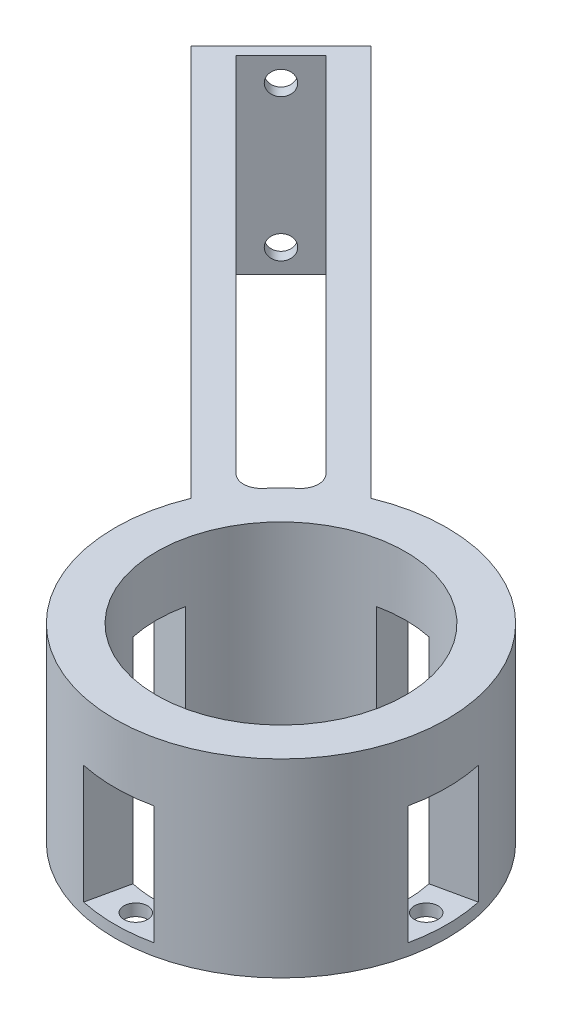
ISO-10303-21;
HEADER;
FILE_DESCRIPTION(('STEP AP214'),'2;1');
FILE_NAME('part.step','',(''),(''),'','','');
FILE_SCHEMA(('AUTOMOTIVE_DESIGN { 1 0 10303 214 1 1 1 1 }'));
ENDSEC;
DATA;
#1=APPLICATION_CONTEXT('core data for automotive mechanical design processes');
#2=APPLICATION_PROTOCOL_DEFINITION('international standard','automotive_design',2000,#1);
#3=PRODUCT_CONTEXT('',#1,'mechanical');
#4=PRODUCT('Part','Part','',(#3));
#5=PRODUCT_RELATED_PRODUCT_CATEGORY('part','',(#4));
#6=PRODUCT_DEFINITION_FORMATION('','',#4);
#7=PRODUCT_DEFINITION_CONTEXT('part definition',#1,'design');
#8=PRODUCT_DEFINITION('design','',#6,#7);
#9=PRODUCT_DEFINITION_SHAPE('','',#8);
#10=(LENGTH_UNIT() NAMED_UNIT(*) SI_UNIT(.MILLI.,.METRE.));
#11=(NAMED_UNIT(*) PLANE_ANGLE_UNIT() SI_UNIT($,.RADIAN.));
#12=(NAMED_UNIT(*) SI_UNIT($,.STERADIAN.) SOLID_ANGLE_UNIT());
#13=UNCERTAINTY_MEASURE_WITH_UNIT(LENGTH_MEASURE(1.E-05),#10,'distance_accuracy_value','');
#14=(GEOMETRIC_REPRESENTATION_CONTEXT(3) GLOBAL_UNCERTAINTY_ASSIGNED_CONTEXT((#13)) GLOBAL_UNIT_ASSIGNED_CONTEXT((#10,
#11,#12)) REPRESENTATION_CONTEXT('',''));
#15=CARTESIAN_POINT('',(0.,0.,0.));
#16=DIRECTION('',(0.,0.,1.));
#17=DIRECTION('',(1.,0.,0.));
#18=AXIS2_PLACEMENT_3D('',#15,#16,#17);
#19=CARTESIAN_POINT('',(0.,2.,0.));
#20=DIRECTION('',(0.,-1.,0.));
#21=DIRECTION('',(0.,0.,-1.));
#22=AXIS2_PLACEMENT_3D('',#19,#20,#21);
#23=CYLINDRICAL_SURFACE('',#22,28.);
#24=CARTESIAN_POINT('',(0.,22.,0.));
#25=DIRECTION('',(0.,1.,0.));
#26=DIRECTION('',(0.,0.,1.));
#27=AXIS2_PLACEMENT_3D('',#24,#25,#26);
#28=CIRCLE('',#27,28.);
#29=CARTESIAN_POINT('',(-5.93539309209322,22.,27.3636822968389));
#30=VERTEX_POINT('',#29);
#31=CARTESIAN_POINT('',(5.93539309209294,22.,27.3636822968389));
#32=VERTEX_POINT('',#31);
#33=EDGE_CURVE('E288',#30,#32,#28,.T.);
#34=ORIENTED_EDGE('',*,*,#33,.T.);
#35=DIRECTION('',(0.,-1.,0.));
#36=VECTOR('',#35,1.);
#37=CARTESIAN_POINT('',(5.93539309209294,32.,27.3636822968389));
#38=LINE('',#37,#36);
#39=CARTESIAN_POINT('',(5.93539309209294,2.,27.3636822968389));
#40=VERTEX_POINT('',#39);
#41=EDGE_CURVE('E344',#32,#40,#38,.T.);
#42=ORIENTED_EDGE('',*,*,#41,.T.);
#43=CARTESIAN_POINT('',(0.,2.,0.));
#44=DIRECTION('',(0.,1.,0.));
#45=DIRECTION('',(0.,0.,1.));
#46=AXIS2_PLACEMENT_3D('',#43,#44,#45);
#47=CIRCLE('',#46,28.);
#48=CARTESIAN_POINT('',(-5.93539309209322,2.,27.3636822968389));
#49=VERTEX_POINT('',#48);
#50=EDGE_CURVE('E413',#49,#40,#47,.T.);
#51=ORIENTED_EDGE('',*,*,#50,.F.);
#52=DIRECTION('',(0.,-1.,0.));
#53=VECTOR('',#52,1.);
#54=CARTESIAN_POINT('',(-5.93539309209322,32.,27.3636822968389));
#55=LINE('',#54,#53);
#56=EDGE_CURVE('E332',#30,#49,#55,.T.);
#57=ORIENTED_EDGE('',*,*,#56,.F.);
#58=EDGE_LOOP('',(#34,#42,#51,#57));
#59=FACE_BOUND('',#58,.T.);
#60=DIRECTION('',(0.,-1.,0.));
#61=VECTOR('',#60,1.);
#62=CARTESIAN_POINT('',(-27.3636822968388,32.,-5.93539309209327));
#63=LINE('',#62,#61);
#64=CARTESIAN_POINT('',(-27.3636822968388,22.,-5.93539309209327));
#65=VERTEX_POINT('',#64);
#66=CARTESIAN_POINT('',(-27.3636822968388,2.,-5.93539309209327));
#67=VERTEX_POINT('',#66);
#68=EDGE_CURVE('E370',#65,#67,#63,.T.);
#69=ORIENTED_EDGE('',*,*,#68,.F.);
#70=CARTESIAN_POINT('',(-27.3636822968389,22.,5.93539309209284));
#71=VERTEX_POINT('',#70);
#72=EDGE_CURVE('E291',#65,#71,#28,.T.);
#73=ORIENTED_EDGE('',*,*,#72,.T.);
#74=DIRECTION('',(0.,-1.,0.));
#75=VECTOR('',#74,1.);
#76=CARTESIAN_POINT('',(-27.3636822968389,32.,5.93539309209284));
#77=LINE('',#76,#75);
#78=CARTESIAN_POINT('',(-27.3636822968389,2.,5.93539309209284));
#79=VERTEX_POINT('',#78);
#80=EDGE_CURVE('E330',#71,#79,#77,.T.);
#81=ORIENTED_EDGE('',*,*,#80,.T.);
#82=EDGE_CURVE('E409',#67,#79,#47,.T.);
#83=ORIENTED_EDGE('',*,*,#82,.F.);
#84=EDGE_LOOP('',(#69,#73,#81,#83));
#85=FACE_BOUND('',#84,.T.);
#86=DIRECTION('',(0.,-1.,0.));
#87=VECTOR('',#86,1.);
#88=CARTESIAN_POINT('',(5.93539309209303,32.,-27.3636822968389));
#89=LINE('',#88,#87);
#90=CARTESIAN_POINT('',(5.93539309209303,22.,-27.3636822968389));
#91=VERTEX_POINT('',#90);
#92=CARTESIAN_POINT('',(5.93539309209303,2.,-27.3636822968389));
#93=VERTEX_POINT('',#92);
#94=EDGE_CURVE('E318',#91,#93,#89,.T.);
#95=ORIENTED_EDGE('',*,*,#94,.F.);
#96=CARTESIAN_POINT('',(-5.93539309209275,22.,-27.363682296839));
#97=VERTEX_POINT('',#96);
#98=EDGE_CURVE('E645',#91,#97,#28,.T.);
#99=ORIENTED_EDGE('',*,*,#98,.T.);
#100=DIRECTION('',(0.,-1.,0.));
#101=VECTOR('',#100,1.);
#102=CARTESIAN_POINT('',(-5.93539309209275,32.,-27.363682296839));
#103=LINE('',#102,#101);
#104=CARTESIAN_POINT('',(-5.93539309209275,2.,-27.363682296839));
#105=VERTEX_POINT('',#104);
#106=EDGE_CURVE('E372',#97,#105,#103,.T.);
#107=ORIENTED_EDGE('',*,*,#106,.T.);
#108=EDGE_CURVE('E414',#93,#105,#47,.T.);
#109=ORIENTED_EDGE('',*,*,#108,.F.);
#110=EDGE_LOOP('',(#95,#99,#107,#109));
#111=FACE_BOUND('',#110,.T.);
#112=DIRECTION('',(0.,-1.,0.));
#113=VECTOR('',#112,1.);
#114=CARTESIAN_POINT('',(27.3636822968389,32.,5.93539309209312));
#115=LINE('',#114,#113);
#116=CARTESIAN_POINT('',(27.3636822968389,22.,5.93539309209312));
#117=VERTEX_POINT('',#116);
#118=CARTESIAN_POINT('',(27.3636822968389,2.,5.93539309209312));
#119=VERTEX_POINT('',#118);
#120=EDGE_CURVE('E346',#117,#119,#115,.T.);
#121=ORIENTED_EDGE('',*,*,#120,.F.);
#122=CARTESIAN_POINT('',(27.3636822968389,22.,-5.93539309209303));
#123=VERTEX_POINT('',#122);
#124=EDGE_CURVE('E292',#117,#123,#28,.T.);
#125=ORIENTED_EDGE('',*,*,#124,.T.);
#126=DIRECTION('',(0.,-1.,0.));
#127=VECTOR('',#126,1.);
#128=CARTESIAN_POINT('',(27.3636822968389,32.,-5.93539309209303));
#129=LINE('',#128,#127);
#130=CARTESIAN_POINT('',(27.3636822968389,2.,-5.93539309209303));
#131=VERTEX_POINT('',#130);
#132=EDGE_CURVE('E320',#123,#131,#129,.T.);
#133=ORIENTED_EDGE('',*,*,#132,.T.);
#134=EDGE_CURVE('E415',#119,#131,#47,.T.);
#135=ORIENTED_EDGE('',*,*,#134,.F.);
#136=EDGE_LOOP('',(#121,#125,#133,#135));
#137=FACE_BOUND('',#136,.T.);
#138=DIRECTION('',(0.,-1.,0.));
#139=VECTOR('',#138,1.);
#140=CARTESIAN_POINT('',(-25.8708818334538,2.,-10.709690619223));
#141=LINE('',#140,#139);
#142=CARTESIAN_POINT('',(-25.8708818334537,0.,-10.709690619223));
#143=VERTEX_POINT('',#142);
#144=CARTESIAN_POINT('',(-25.8708818334538,32.,-10.709690619223));
#145=VERTEX_POINT('',#144);
#146=EDGE_CURVE('E265',#143,#145,#141,.F.);
#147=ORIENTED_EDGE('',*,*,#146,.F.);
#148=CARTESIAN_POINT('',(0.,0.,0.));
#149=DIRECTION('',(0.,1.,0.));
#150=DIRECTION('',(0.,0.,1.));
#151=AXIS2_PLACEMENT_3D('',#148,#149,#150);
#152=CIRCLE('',#151,28.);
#153=CARTESIAN_POINT('',(-10.7096906192229,0.,-25.8708818334538));
#154=VERTEX_POINT('',#153);
#155=EDGE_CURVE('E218',#143,#154,#152,.T.);
#156=ORIENTED_EDGE('',*,*,#155,.T.);
#157=DIRECTION('',(0.,-1.,0.));
#158=VECTOR('',#157,1.);
#159=CARTESIAN_POINT('',(-10.7096906192229,2.,-25.8708818334538));
#160=LINE('',#159,#158);
#161=CARTESIAN_POINT('',(-10.7096906192229,32.,-25.8708818334538));
#162=VERTEX_POINT('',#161);
#163=EDGE_CURVE('E280',#154,#162,#160,.F.);
#164=ORIENTED_EDGE('',*,*,#163,.T.);
#165=CARTESIAN_POINT('',(0.,32.,0.));
#166=DIRECTION('',(0.,1.,0.));
#167=DIRECTION('',(0.,0.,1.));
#168=AXIS2_PLACEMENT_3D('',#165,#166,#167);
#169=CIRCLE('',#168,28.);
#170=EDGE_CURVE('E360',#145,#162,#169,.T.);
#171=ORIENTED_EDGE('',*,*,#170,.F.);
#172=EDGE_LOOP('',(#147,#156,#164,#171));
#173=FACE_BOUND('',#172,.T.);
#174=ADVANCED_FACE('F38',(#59,#85,#111,#137,#173),#23,.T.);
#175=CARTESIAN_POINT('',(-18.2340550149293,32.,-21.248982039442));
#176=VERTEX_POINT('',#175);
#177=CARTESIAN_POINT('',(-21.248982039442,32.,-18.2340550149294));
#178=VERTEX_POINT('',#177);
#179=EDGE_CURVE('E362',#176,#178,#169,.T.);
#180=ORIENTED_EDGE('',*,*,#179,.F.);
#181=DIRECTION('',(0.,-1.,0.));
#182=VECTOR('',#181,1.);
#183=CARTESIAN_POINT('',(-18.2340550149293,2.,-21.248982039442));
#184=LINE('',#183,#182);
#185=CARTESIAN_POINT('',(-18.2340550149293,0.,-21.248982039442));
#186=VERTEX_POINT('',#185);
#187=EDGE_CURVE('E427',#176,#186,#184,.T.);
#188=ORIENTED_EDGE('',*,*,#187,.T.);
#189=CARTESIAN_POINT('',(-21.248982039442,0.,-18.2340550149294));
#190=VERTEX_POINT('',#189);
#191=EDGE_CURVE('E416',#186,#190,#152,.T.);
#192=ORIENTED_EDGE('',*,*,#191,.T.);
#193=DIRECTION('',(0.,-1.,0.));
#194=VECTOR('',#193,1.);
#195=CARTESIAN_POINT('',(-21.248982039442,2.,-18.2340550149294));
#196=LINE('',#195,#194);
#197=EDGE_CURVE('E424',#190,#178,#196,.F.);
#198=ORIENTED_EDGE('',*,*,#197,.T.);
#199=EDGE_LOOP('',(#180,#188,#192,#198));
#200=FACE_BOUND('',#199,.T.);
#201=ADVANCED_FACE('F449',(#200),#23,.T.);
#202=CARTESIAN_POINT('',(0.,2.,0.));
#203=DIRECTION('',(0.,-1.,0.));
#204=DIRECTION('',(0.,0.,-1.));
#205=AXIS2_PLACEMENT_3D('',#202,#203,#204);
#206=CYLINDRICAL_SURFACE('',#205,21.);
#207=CARTESIAN_POINT('',(0.,32.,0.));
#208=DIRECTION('',(0.,1.,0.));
#209=DIRECTION('',(0.,0.,1.));
#210=AXIS2_PLACEMENT_3D('',#207,#208,#209);
#211=CIRCLE('',#210,21.);
#212=CARTESIAN_POINT('',(0.,32.,21.));
#213=VERTEX_POINT('',#212);
#214=EDGE_CURVE('E357',#213,#213,#211,.F.);
#215=ORIENTED_EDGE('',*,*,#214,.F.);
#216=EDGE_LOOP('',(#215));
#217=FACE_BOUND('',#216,.T.);
#218=CARTESIAN_POINT('',(0.,0.,0.));
#219=DIRECTION('',(0.,1.,0.));
#220=DIRECTION('',(0.,0.,1.));
#221=AXIS2_PLACEMENT_3D('',#218,#219,#220);
#222=CIRCLE('',#221,21.);
#223=CARTESIAN_POINT('',(0.,0.,21.));
#224=VERTEX_POINT('',#223);
#225=EDGE_CURVE('E392',#224,#224,#222,.T.);
#226=ORIENTED_EDGE('',*,*,#225,.F.);
#227=EDGE_LOOP('',(#226));
#228=FACE_BOUND('',#227,.T.);
#229=CARTESIAN_POINT('',(0.,22.,0.));
#230=DIRECTION('',(0.,1.,0.));
#231=DIRECTION('',(0.,0.,1.));
#232=AXIS2_PLACEMENT_3D('',#229,#230,#231);
#233=CIRCLE('',#232,21.);
#234=CARTESIAN_POINT('',(20.5227617226292,22.,4.45154481906984));
#235=VERTEX_POINT('',#234);
#236=CARTESIAN_POINT('',(20.5227617226292,22.,-4.45154481906977));
#237=VERTEX_POINT('',#236);
#238=EDGE_CURVE('E287',#235,#237,#233,.T.);
#239=ORIENTED_EDGE('',*,*,#238,.F.);
#240=DIRECTION('',(0.,-1.,0.));
#241=VECTOR('',#240,1.);
#242=CARTESIAN_POINT('',(20.5227617226292,32.,4.45154481906984));
#243=LINE('',#242,#241);
#244=CARTESIAN_POINT('',(20.5227617226292,2.,4.45154481906984));
#245=VERTEX_POINT('',#244);
#246=EDGE_CURVE('E348',#235,#245,#243,.T.);
#247=ORIENTED_EDGE('',*,*,#246,.T.);
#248=CARTESIAN_POINT('',(0.,2.,0.));
#249=DIRECTION('',(0.,1.,0.));
#250=DIRECTION('',(0.,0.,1.));
#251=AXIS2_PLACEMENT_3D('',#248,#249,#250);
#252=CIRCLE('',#251,21.);
#253=CARTESIAN_POINT('',(20.5227617226292,2.,-4.45154481906977));
#254=VERTEX_POINT('',#253);
#255=EDGE_CURVE('E401',#245,#254,#252,.T.);
#256=ORIENTED_EDGE('',*,*,#255,.T.);
#257=DIRECTION('',(0.,-1.,0.));
#258=VECTOR('',#257,1.);
#259=CARTESIAN_POINT('',(20.5227617226292,32.,-4.45154481906977));
#260=LINE('',#259,#258);
#261=EDGE_CURVE('E314',#237,#254,#260,.T.);
#262=ORIENTED_EDGE('',*,*,#261,.F.);
#263=EDGE_LOOP('',(#239,#247,#256,#262));
#264=FACE_BOUND('',#263,.T.);
#265=CARTESIAN_POINT('',(4.45154481906978,22.,-20.5227617226292));
#266=VERTEX_POINT('',#265);
#267=CARTESIAN_POINT('',(-4.45154481906956,22.,-20.5227617226292));
#268=VERTEX_POINT('',#267);
#269=EDGE_CURVE('E634',#266,#268,#233,.T.);
#270=ORIENTED_EDGE('',*,*,#269,.F.);
#271=DIRECTION('',(0.,-1.,0.));
#272=VECTOR('',#271,1.);
#273=CARTESIAN_POINT('',(4.45154481906978,32.,-20.5227617226292));
#274=LINE('',#273,#272);
#275=CARTESIAN_POINT('',(4.45154481906978,2.,-20.5227617226292));
#276=VERTEX_POINT('',#275);
#277=EDGE_CURVE('E315',#266,#276,#274,.T.);
#278=ORIENTED_EDGE('',*,*,#277,.T.);
#279=CARTESIAN_POINT('',(-4.45154481906956,2.,-20.5227617226292));
#280=VERTEX_POINT('',#279);
#281=EDGE_CURVE('E400',#276,#280,#252,.T.);
#282=ORIENTED_EDGE('',*,*,#281,.T.);
#283=DIRECTION('',(0.,-1.,0.));
#284=VECTOR('',#283,1.);
#285=CARTESIAN_POINT('',(-4.45154481906956,32.,-20.5227617226292));
#286=LINE('',#285,#284);
#287=EDGE_CURVE('E374',#268,#280,#286,.T.);
#288=ORIENTED_EDGE('',*,*,#287,.F.);
#289=EDGE_LOOP('',(#270,#278,#282,#288));
#290=FACE_BOUND('',#289,.T.);
#291=CARTESIAN_POINT('',(-20.5227617226291,22.,-4.45154481906995));
#292=VERTEX_POINT('',#291);
#293=CARTESIAN_POINT('',(-20.5227617226292,22.,4.45154481906963));
#294=VERTEX_POINT('',#293);
#295=EDGE_CURVE('E286',#292,#294,#233,.T.);
#296=ORIENTED_EDGE('',*,*,#295,.F.);
#297=DIRECTION('',(0.,-1.,0.));
#298=VECTOR('',#297,1.);
#299=CARTESIAN_POINT('',(-20.5227617226291,32.,-4.45154481906995));
#300=LINE('',#299,#298);
#301=CARTESIAN_POINT('',(-20.5227617226291,2.,-4.45154481906995));
#302=VERTEX_POINT('',#301);
#303=EDGE_CURVE('E364',#292,#302,#300,.T.);
#304=ORIENTED_EDGE('',*,*,#303,.T.);
#305=CARTESIAN_POINT('',(-20.5227617226292,2.,4.45154481906963));
#306=VERTEX_POINT('',#305);
#307=EDGE_CURVE('E395',#302,#306,#252,.T.);
#308=ORIENTED_EDGE('',*,*,#307,.T.);
#309=DIRECTION('',(0.,-1.,0.));
#310=VECTOR('',#309,1.);
#311=CARTESIAN_POINT('',(-20.5227617226292,32.,4.45154481906963));
#312=LINE('',#311,#310);
#313=EDGE_CURVE('E328',#294,#306,#312,.T.);
#314=ORIENTED_EDGE('',*,*,#313,.F.);
#315=EDGE_LOOP('',(#296,#304,#308,#314));
#316=FACE_BOUND('',#315,.T.);
#317=DIRECTION('',(0.,-1.,0.));
#318=VECTOR('',#317,1.);
#319=CARTESIAN_POINT('',(4.45154481906971,32.,20.5227617226292));
#320=LINE('',#319,#318);
#321=CARTESIAN_POINT('',(4.45154481906971,22.,20.5227617226292));
#322=VERTEX_POINT('',#321);
#323=CARTESIAN_POINT('',(4.45154481906971,2.,20.5227617226292));
#324=VERTEX_POINT('',#323);
#325=EDGE_CURVE('E342',#322,#324,#320,.T.);
#326=ORIENTED_EDGE('',*,*,#325,.F.);
#327=CARTESIAN_POINT('',(-4.45154481906991,22.,20.5227617226291));
#328=VERTEX_POINT('',#327);
#329=EDGE_CURVE('E283',#328,#322,#233,.T.);
#330=ORIENTED_EDGE('',*,*,#329,.F.);
#331=DIRECTION('',(0.,-1.,0.));
#332=VECTOR('',#331,1.);
#333=CARTESIAN_POINT('',(-4.45154481906991,32.,20.5227617226291));
#334=LINE('',#333,#332);
#335=CARTESIAN_POINT('',(-4.45154481906991,2.,20.5227617226291));
#336=VERTEX_POINT('',#335);
#337=EDGE_CURVE('E334',#328,#336,#334,.T.);
#338=ORIENTED_EDGE('',*,*,#337,.T.);
#339=EDGE_CURVE('E399',#336,#324,#252,.T.);
#340=ORIENTED_EDGE('',*,*,#339,.T.);
#341=EDGE_LOOP('',(#326,#330,#338,#340));
#342=FACE_BOUND('',#341,.T.);
#343=ADVANCED_FACE('F479',(#217,#228,#264,#290,#316,#342),#206,.F.);
#344=CARTESIAN_POINT('',(0.,32.,0.));
#345=DIRECTION('',(-0.977274367744248,0.,0.211978324717598));
#346=DIRECTION('',(0.211978324717598,0.,0.977274367744248));
#347=AXIS2_PLACEMENT_3D('',#344,#345,#346);
#348=PLANE('',#347);
#349=DIRECTION('',(-0.211978324717598,0.,-0.977274367744248));
#350=VECTOR('',#349,1.);
#351=CARTESIAN_POINT('',(0.,22.,0.));
#352=LINE('',#351,#350);
#353=EDGE_CURVE('E311',#268,#97,#352,.T.);
#354=ORIENTED_EDGE('',*,*,#353,.F.);
#355=ORIENTED_EDGE('',*,*,#287,.T.);
#356=DIRECTION('',(-0.211978324717598,0.,-0.977274367744248));
#357=VECTOR('',#356,1.);
#358=CARTESIAN_POINT('',(0.,2.,0.));
#359=LINE('',#358,#357);
#360=EDGE_CURVE('E356',#280,#105,#359,.T.);
#361=ORIENTED_EDGE('',*,*,#360,.T.);
#362=ORIENTED_EDGE('',*,*,#106,.F.);
#363=EDGE_LOOP('',(#354,#355,#361,#362));
#364=FACE_BOUND('',#363,.T.);
#365=ADVANCED_FACE('F544',(#364),#348,.F.);
#366=CARTESIAN_POINT('',(0.,32.,0.));
#367=DIRECTION('',(-0.211978324717617,0.,0.977274367744244));
#368=DIRECTION('',(0.977274367744244,0.,0.211978324717617));
#369=AXIS2_PLACEMENT_3D('',#366,#367,#368);
#370=PLANE('',#369);
#371=ORIENTED_EDGE('',*,*,#303,.F.);
#372=DIRECTION('',(-0.977274367744244,0.,-0.211978324717617));
#373=VECTOR('',#372,1.);
#374=CARTESIAN_POINT('',(0.,22.,0.));
#375=LINE('',#374,#373);
#376=EDGE_CURVE('E308',#292,#65,#375,.T.);
#377=ORIENTED_EDGE('',*,*,#376,.T.);
#378=ORIENTED_EDGE('',*,*,#68,.T.);
#379=DIRECTION('',(-0.977274367744244,0.,-0.211978324717617));
#380=VECTOR('',#379,1.);
#381=CARTESIAN_POINT('',(0.,2.,0.));
#382=LINE('',#381,#380);
#383=EDGE_CURVE('E361',#302,#67,#382,.T.);
#384=ORIENTED_EDGE('',*,*,#383,.F.);
#385=EDGE_LOOP('',(#371,#377,#378,#384));
#386=FACE_BOUND('',#385,.T.);
#387=ADVANCED_FACE('F533',(#386),#370,.T.);
#388=CARTESIAN_POINT('',(0.,32.,0.));
#389=DIRECTION('',(0.977274367744247,0.,-0.211978324717605));
#390=DIRECTION('',(-0.211978324717605,0.,-0.977274367744247));
#391=AXIS2_PLACEMENT_3D('',#388,#389,#390);
#392=PLANE('',#391);
#393=DIRECTION('',(0.211978324717605,0.,0.977274367744247));
#394=VECTOR('',#393,1.);
#395=CARTESIAN_POINT('',(0.,22.,0.));
#396=LINE('',#395,#394);
#397=EDGE_CURVE('E305',#322,#32,#396,.T.);
#398=ORIENTED_EDGE('',*,*,#397,.F.);
#399=ORIENTED_EDGE('',*,*,#325,.T.);
#400=DIRECTION('',(0.211978324717605,0.,0.977274367744247));
#401=VECTOR('',#400,1.);
#402=CARTESIAN_POINT('',(0.,2.,0.));
#403=LINE('',#402,#401);
#404=EDGE_CURVE('E353',#324,#40,#403,.T.);
#405=ORIENTED_EDGE('',*,*,#404,.T.);
#406=ORIENTED_EDGE('',*,*,#41,.F.);
#407=EDGE_LOOP('',(#398,#399,#405,#406));
#408=FACE_BOUND('',#407,.T.);
#409=ADVANCED_FACE('F530',(#408),#392,.F.);
#410=CARTESIAN_POINT('',(0.,32.,0.));
#411=DIRECTION('',(0.211978324717611,0.,-0.977274367744245));
#412=DIRECTION('',(-0.977274367744246,0.,-0.211978324717612));
#413=AXIS2_PLACEMENT_3D('',#410,#411,#412);
#414=PLANE('',#413);
#415=ORIENTED_EDGE('',*,*,#246,.F.);
#416=DIRECTION('',(0.977274367744246,0.,0.211978324717612));
#417=VECTOR('',#416,1.);
#418=CARTESIAN_POINT('',(0.,22.,0.));
#419=LINE('',#418,#417);
#420=EDGE_CURVE('E302',#235,#117,#419,.T.);
#421=ORIENTED_EDGE('',*,*,#420,.T.);
#422=ORIENTED_EDGE('',*,*,#120,.T.);
#423=DIRECTION('',(0.977274367744246,0.,0.211978324717612));
#424=VECTOR('',#423,1.);
#425=CARTESIAN_POINT('',(0.,2.,0.));
#426=LINE('',#425,#424);
#427=EDGE_CURVE('E350',#245,#119,#426,.T.);
#428=ORIENTED_EDGE('',*,*,#427,.F.);
#429=EDGE_LOOP('',(#415,#421,#422,#428));
#430=FACE_BOUND('',#429,.T.);
#431=ADVANCED_FACE('F525',(#430),#414,.T.);
#432=CARTESIAN_POINT('',(0.,32.,0.));
#433=DIRECTION('',(0.211978324717602,0.,0.977274367744248));
#434=DIRECTION('',(0.977274367744248,0.,-0.211978324717602));
#435=AXIS2_PLACEMENT_3D('',#432,#433,#434);
#436=PLANE('',#435);
#437=DIRECTION('',(-0.977274367744248,0.,0.211978324717602));
#438=VECTOR('',#437,1.);
#439=CARTESIAN_POINT('',(0.,22.,0.));
#440=LINE('',#439,#438);
#441=EDGE_CURVE('E299',#294,#71,#440,.T.);
#442=ORIENTED_EDGE('',*,*,#441,.F.);
#443=ORIENTED_EDGE('',*,*,#313,.T.);
#444=DIRECTION('',(-0.977274367744248,0.,0.211978324717602));
#445=VECTOR('',#444,1.);
#446=CARTESIAN_POINT('',(0.,2.,0.));
#447=LINE('',#446,#445);
#448=EDGE_CURVE('E339',#306,#79,#447,.T.);
#449=ORIENTED_EDGE('',*,*,#448,.T.);
#450=ORIENTED_EDGE('',*,*,#80,.F.);
#451=EDGE_LOOP('',(#442,#443,#449,#450));
#452=FACE_BOUND('',#451,.T.);
#453=ADVANCED_FACE('F522',(#452),#436,.F.);
#454=CARTESIAN_POINT('',(0.,32.,0.));
#455=DIRECTION('',(0.977274367744245,0.,0.211978324717615));
#456=DIRECTION('',(0.211978324717615,0.,-0.977274367744245));
#457=AXIS2_PLACEMENT_3D('',#454,#455,#456);
#458=PLANE('',#457);
#459=ORIENTED_EDGE('',*,*,#337,.F.);
#460=DIRECTION('',(-0.211978324717615,0.,0.977274367744245));
#461=VECTOR('',#460,1.);
#462=CARTESIAN_POINT('',(0.,22.,0.));
#463=LINE('',#462,#461);
#464=EDGE_CURVE('E296',#328,#30,#463,.T.);
#465=ORIENTED_EDGE('',*,*,#464,.T.);
#466=ORIENTED_EDGE('',*,*,#56,.T.);
#467=DIRECTION('',(-0.211978324717615,0.,0.977274367744245));
#468=VECTOR('',#467,1.);
#469=CARTESIAN_POINT('',(0.,2.,0.));
#470=LINE('',#469,#468);
#471=EDGE_CURVE('E336',#336,#49,#470,.T.);
#472=ORIENTED_EDGE('',*,*,#471,.F.);
#473=EDGE_LOOP('',(#459,#465,#466,#472));
#474=FACE_BOUND('',#473,.T.);
#475=ADVANCED_FACE('F520',(#474),#458,.T.);
#476=CARTESIAN_POINT('',(20.5227617226292,32.,-4.45154481906977));
#477=DIRECTION('',(-0.211978324717608,0.,-0.977274367744246));
#478=DIRECTION('',(-0.977274367744246,0.,0.211978324717608));
#479=AXIS2_PLACEMENT_3D('',#476,#477,#478);
#480=PLANE('',#479);
#481=DIRECTION('',(0.977274367744246,0.,-0.211978324717608));
#482=VECTOR('',#481,1.);
#483=CARTESIAN_POINT('',(20.5227617226292,22.,-4.45154481906977));
#484=LINE('',#483,#482);
#485=EDGE_CURVE('E293',#237,#123,#484,.T.);
#486=ORIENTED_EDGE('',*,*,#485,.F.);
#487=ORIENTED_EDGE('',*,*,#261,.T.);
#488=DIRECTION('',(0.977274367744246,0.,-0.211978324717608));
#489=VECTOR('',#488,1.);
#490=CARTESIAN_POINT('',(20.5227617226292,2.,-4.45154481906977));
#491=LINE('',#490,#489);
#492=EDGE_CURVE('E317',#254,#131,#491,.T.);
#493=ORIENTED_EDGE('',*,*,#492,.T.);
#494=ORIENTED_EDGE('',*,*,#132,.F.);
#495=EDGE_LOOP('',(#486,#487,#493,#494));
#496=FACE_BOUND('',#495,.T.);
#497=ADVANCED_FACE('F516',(#496),#480,.F.);
#498=CARTESIAN_POINT('',(4.45154481906978,32.,-20.5227617226292));
#499=DIRECTION('',(-0.977274367744246,0.,-0.211978324717608));
#500=DIRECTION('',(-0.211978324717608,0.,0.977274367744246));
#501=AXIS2_PLACEMENT_3D('',#498,#499,#500);
#502=PLANE('',#501);
#503=ORIENTED_EDGE('',*,*,#277,.F.);
#504=DIRECTION('',(0.211978324717608,0.,-0.977274367744246));
#505=VECTOR('',#504,1.);
#506=CARTESIAN_POINT('',(4.45154481906978,22.,-20.5227617226292));
#507=LINE('',#506,#505);
#508=EDGE_CURVE('E412',#266,#91,#507,.T.);
#509=ORIENTED_EDGE('',*,*,#508,.T.);
#510=ORIENTED_EDGE('',*,*,#94,.T.);
#511=DIRECTION('',(0.211978324717608,0.,-0.977274367744246));
#512=VECTOR('',#511,1.);
#513=CARTESIAN_POINT('',(4.45154481906978,2.,-20.5227617226292));
#514=LINE('',#513,#512);
#515=EDGE_CURVE('E325',#276,#93,#514,.T.);
#516=ORIENTED_EDGE('',*,*,#515,.F.);
#517=EDGE_LOOP('',(#503,#509,#510,#516));
#518=FACE_BOUND('',#517,.T.);
#519=ADVANCED_FACE('F512',(#518),#502,.T.);
#520=CARTESIAN_POINT('',(0.,2.,0.));
#521=DIRECTION('',(0.,1.,0.));
#522=DIRECTION('',(0.,0.,1.));
#523=AXIS2_PLACEMENT_3D('',#520,#521,#522);
#524=PLANE('',#523);
#525=CARTESIAN_POINT('',(24.5,2.,1.71082585603314E-13));
#526=DIRECTION('',(0.,1.,0.));
#527=DIRECTION('',(0.,0.,1.));
#528=AXIS2_PLACEMENT_3D('',#525,#526,#527);
#529=CIRCLE('',#528,2.);
#530=CARTESIAN_POINT('',(24.5,2.,2.00000000000017));
#531=VERTEX_POINT('',#530);
#532=EDGE_CURVE('E383',#531,#531,#529,.T.);
#533=ORIENTED_EDGE('',*,*,#532,.F.);
#534=EDGE_LOOP('',(#533));
#535=FACE_BOUND('',#534,.T.);
#536=ORIENTED_EDGE('',*,*,#134,.T.);
#537=ORIENTED_EDGE('',*,*,#492,.F.);
#538=ORIENTED_EDGE('',*,*,#255,.F.);
#539=ORIENTED_EDGE('',*,*,#427,.T.);
#540=EDGE_LOOP('',(#536,#537,#538,#539));
#541=FACE_BOUND('',#540,.T.);
#542=ADVANCED_FACE('F515',(#535,#541),#524,.T.);
#543=CARTESIAN_POINT('',(-24.5,2.,0.));
#544=DIRECTION('',(0.,1.,0.));
#545=DIRECTION('',(0.,0.,1.));
#546=AXIS2_PLACEMENT_3D('',#543,#544,#545);
#547=CIRCLE('',#546,2.);
#548=CARTESIAN_POINT('',(-24.5,2.,2.));
#549=VERTEX_POINT('',#548);
#550=EDGE_CURVE('E404',#549,#549,#547,.T.);
#551=ORIENTED_EDGE('',*,*,#550,.F.);
#552=EDGE_LOOP('',(#551));
#553=FACE_BOUND('',#552,.T.);
#554=ORIENTED_EDGE('',*,*,#82,.T.);
#555=ORIENTED_EDGE('',*,*,#448,.F.);
#556=ORIENTED_EDGE('',*,*,#307,.F.);
#557=ORIENTED_EDGE('',*,*,#383,.T.);
#558=EDGE_LOOP('',(#554,#555,#556,#557));
#559=FACE_BOUND('',#558,.T.);
#560=ADVANCED_FACE('F574',(#553,#559),#524,.T.);
#561=ORIENTED_EDGE('',*,*,#471,.T.);
#562=ORIENTED_EDGE('',*,*,#50,.T.);
#563=ORIENTED_EDGE('',*,*,#404,.F.);
#564=ORIENTED_EDGE('',*,*,#339,.F.);
#565=EDGE_LOOP('',(#561,#562,#563,#564));
#566=FACE_BOUND('',#565,.T.);
#567=CARTESIAN_POINT('',(-2.5662387840497E-13,2.,24.5));
#568=DIRECTION('',(0.,1.,0.));
#569=DIRECTION('',(0.,0.,1.));
#570=AXIS2_PLACEMENT_3D('',#567,#568,#569);
#571=CIRCLE('',#570,2.);
#572=CARTESIAN_POINT('',(-2.5662387840497E-13,2.,26.5));
#573=VERTEX_POINT('',#572);
#574=EDGE_CURVE('E377',#573,#573,#571,.T.);
#575=ORIENTED_EDGE('',*,*,#574,.F.);
#576=EDGE_LOOP('',(#575));
#577=FACE_BOUND('',#576,.T.);
#578=ADVANCED_FACE('F568',(#566,#577),#524,.T.);
#579=ORIENTED_EDGE('',*,*,#515,.T.);
#580=ORIENTED_EDGE('',*,*,#108,.T.);
#581=ORIENTED_EDGE('',*,*,#360,.F.);
#582=ORIENTED_EDGE('',*,*,#281,.F.);
#583=EDGE_LOOP('',(#579,#580,#581,#582));
#584=FACE_BOUND('',#583,.T.);
#585=CARTESIAN_POINT('',(0.,2.,-24.5));
#586=DIRECTION('',(0.,1.,0.));
#587=DIRECTION('',(0.,0.,1.));
#588=AXIS2_PLACEMENT_3D('',#585,#586,#587);
#589=CIRCLE('',#588,2.);
#590=CARTESIAN_POINT('',(0.,2.,-22.5));
#591=VERTEX_POINT('',#590);
#592=EDGE_CURVE('E389',#591,#591,#589,.T.);
#593=ORIENTED_EDGE('',*,*,#592,.F.);
#594=EDGE_LOOP('',(#593));
#595=FACE_BOUND('',#594,.T.);
#596=ADVANCED_FACE('F566',(#584,#595),#524,.T.);
#597=CARTESIAN_POINT('',(0.,0.,0.));
#598=DIRECTION('',(0.,1.,0.));
#599=DIRECTION('',(0.,0.,1.));
#600=AXIS2_PLACEMENT_3D('',#597,#598,#599);
#601=PLANE('',#600);
#602=DIRECTION('',(0.707106781186546,0.,0.707106781186549));
#603=VECTOR('',#602,1.);
#604=CARTESIAN_POINT('',(-79.1703803150969,0.,-86.7509759222126));
#605=LINE('',#604,#603);
#606=CARTESIAN_POINT('',(-79.1703803150969,0.,-86.7509759222126));
#607=VERTEX_POINT('',#606);
#608=CARTESIAN_POINT('',(-18.0663834229693,0.,-25.6469790300848));
#609=VERTEX_POINT('',#608);
#610=EDGE_CURVE('E269',#607,#609,#605,.T.);
#611=ORIENTED_EDGE('',*,*,#610,.F.);
#612=DIRECTION('',(0.707106781186549,0.,-0.707106781186546));
#613=VECTOR('',#612,1.);
#614=CARTESIAN_POINT('',(-82.9606781186546,0.,-82.9606781186549));
#615=LINE('',#614,#613);
#616=CARTESIAN_POINT('',(-86.7509759222123,0.,-79.1703803150972));
#617=VERTEX_POINT('',#616);
#618=EDGE_CURVE('E253',#617,#607,#615,.T.);
#619=ORIENTED_EDGE('',*,*,#618,.F.);
#620=DIRECTION('',(0.707106781186546,0.,0.707106781186549));
#621=VECTOR('',#620,1.);
#622=CARTESIAN_POINT('',(-86.7509759222123,0.,-79.1703803150972));
#623=LINE('',#622,#621);
#624=CARTESIAN_POINT('',(-25.6469790300847,0.,-18.0663834229694));
#625=VERTEX_POINT('',#624);
#626=EDGE_CURVE('E223',#617,#625,#623,.T.);
#627=ORIENTED_EDGE('',*,*,#626,.T.);
#628=CARTESIAN_POINT('',(-23.525658686525,0.,-20.187703766529));
#629=DIRECTION('',(0.,1.,0.));
#630=DIRECTION('',(0.,0.,1.));
#631=AXIS2_PLACEMENT_3D('',#628,#629,#630);
#632=CIRCLE('',#631,3.);
#633=EDGE_CURVE('E11',#625,#190,#632,.T.);
#634=ORIENTED_EDGE('',*,*,#633,.T.);
#635=ORIENTED_EDGE('',*,*,#191,.F.);
#636=CARTESIAN_POINT('',(-20.1877037665289,0.,-23.5256586865251));
#637=DIRECTION('',(0.,1.,0.));
#638=DIRECTION('',(0.,0.,1.));
#639=AXIS2_PLACEMENT_3D('',#636,#637,#638);
#640=CIRCLE('',#639,3.);
#641=EDGE_CURVE('E432',#186,#609,#640,.T.);
#642=ORIENTED_EDGE('',*,*,#641,.T.);
#643=EDGE_LOOP('',(#611,#619,#627,#634,#635,#642));
#644=FACE_BOUND('',#643,.T.);
#645=ORIENTED_EDGE('',*,*,#155,.F.);
#646=DIRECTION('',(0.707106781186546,0.,0.707106781186549));
#647=VECTOR('',#646,1.);
#648=CARTESIAN_POINT('',(-90.54127372577,0.,-75.3800825115395));
#649=LINE('',#648,#647);
#650=CARTESIAN_POINT('',(-91.9554872881431,0.,-76.7942960739126));
#651=VERTEX_POINT('',#650);
#652=EDGE_CURVE('E210',#651,#143,#649,.T.);
#653=ORIENTED_EDGE('',*,*,#652,.F.);
#654=DIRECTION('',(0.707106781186549,0.,-0.707106781186546));
#655=VECTOR('',#654,1.);
#656=CARTESIAN_POINT('',(-84.3748916810276,0.,-84.374891681028));
#657=LINE('',#656,#655);
#658=CARTESIAN_POINT('',(-76.7942960739122,0.,-91.9554872881434));
#659=VERTEX_POINT('',#658);
#660=EDGE_CURVE('E216',#651,#659,#657,.T.);
#661=ORIENTED_EDGE('',*,*,#660,.T.);
#662=DIRECTION('',(0.707106781186546,0.,0.707106781186549));
#663=VECTOR('',#662,1.);
#664=CARTESIAN_POINT('',(-75.3800825115391,0.,-90.5412737257703));
#665=LINE('',#664,#663);
#666=EDGE_CURVE('E272',#659,#154,#665,.T.);
#667=ORIENTED_EDGE('',*,*,#666,.T.);
#668=EDGE_LOOP('',(#645,#653,#661,#667));
#669=FACE_BOUND('',#668,.T.);
#670=ORIENTED_EDGE('',*,*,#225,.T.);
#671=EDGE_LOOP('',(#670));
#672=FACE_BOUND('',#671,.T.);
#673=CARTESIAN_POINT('',(-24.5,0.,0.));
#674=DIRECTION('',(0.,1.,0.));
#675=DIRECTION('',(0.,0.,1.));
#676=AXIS2_PLACEMENT_3D('',#673,#674,#675);
#677=CIRCLE('',#676,2.);
#678=CARTESIAN_POINT('',(-24.5,0.,2.));
#679=VERTEX_POINT('',#678);
#680=EDGE_CURVE('E398',#679,#679,#677,.T.);
#681=ORIENTED_EDGE('',*,*,#680,.T.);
#682=EDGE_LOOP('',(#681));
#683=FACE_BOUND('',#682,.T.);
#684=CARTESIAN_POINT('',(0.,0.,-24.5));
#685=DIRECTION('',(0.,1.,0.));
#686=DIRECTION('',(0.,0.,1.));
#687=AXIS2_PLACEMENT_3D('',#684,#685,#686);
#688=CIRCLE('',#687,2.);
#689=CARTESIAN_POINT('',(0.,0.,-22.5));
#690=VERTEX_POINT('',#689);
#691=EDGE_CURVE('E386',#690,#690,#688,.T.);
#692=ORIENTED_EDGE('',*,*,#691,.T.);
#693=EDGE_LOOP('',(#692));
#694=FACE_BOUND('',#693,.T.);
#695=CARTESIAN_POINT('',(24.5,0.,1.71082585603314E-13));
#696=DIRECTION('',(0.,1.,0.));
#697=DIRECTION('',(0.,0.,1.));
#698=AXIS2_PLACEMENT_3D('',#695,#696,#697);
#699=CIRCLE('',#698,2.);
#700=CARTESIAN_POINT('',(24.5,0.,2.00000000000017));
#701=VERTEX_POINT('',#700);
#702=EDGE_CURVE('E380',#701,#701,#699,.T.);
#703=ORIENTED_EDGE('',*,*,#702,.T.);
#704=EDGE_LOOP('',(#703));
#705=FACE_BOUND('',#704,.T.);
#706=CARTESIAN_POINT('',(-2.5662387840497E-13,0.,24.5));
#707=DIRECTION('',(0.,1.,0.));
#708=DIRECTION('',(0.,0.,1.));
#709=AXIS2_PLACEMENT_3D('',#706,#707,#708);
#710=CIRCLE('',#709,2.);
#711=CARTESIAN_POINT('',(-2.5662387840497E-13,0.,26.5));
#712=VERTEX_POINT('',#711);
#713=EDGE_CURVE('E376',#712,#712,#710,.T.);
#714=ORIENTED_EDGE('',*,*,#713,.T.);
#715=EDGE_LOOP('',(#714));
#716=FACE_BOUND('',#715,.T.);
#717=ADVANCED_FACE('F212',(#644,#669,#672,#683,#694,#705,#716),#601,.F.);
#718=CARTESIAN_POINT('',(-24.5,2.,0.));
#719=DIRECTION('',(0.,-1.,0.));
#720=DIRECTION('',(0.,0.,-1.));
#721=AXIS2_PLACEMENT_3D('',#718,#719,#720);
#722=CYLINDRICAL_SURFACE('',#721,2.);
#723=ORIENTED_EDGE('',*,*,#550,.T.);
#724=EDGE_LOOP('',(#723));
#725=FACE_BOUND('',#724,.T.);
#726=ORIENTED_EDGE('',*,*,#680,.F.);
#727=EDGE_LOOP('',(#726));
#728=FACE_BOUND('',#727,.T.);
#729=ADVANCED_FACE('F559',(#725,#728),#722,.F.);
#730=CARTESIAN_POINT('',(0.,2.,-24.5));
#731=DIRECTION('',(0.,-1.,0.));
#732=DIRECTION('',(0.,0.,-1.));
#733=AXIS2_PLACEMENT_3D('',#730,#731,#732);
#734=CYLINDRICAL_SURFACE('',#733,2.);
#735=ORIENTED_EDGE('',*,*,#592,.T.);
#736=EDGE_LOOP('',(#735));
#737=FACE_BOUND('',#736,.T.);
#738=ORIENTED_EDGE('',*,*,#691,.F.);
#739=EDGE_LOOP('',(#738));
#740=FACE_BOUND('',#739,.T.);
#741=ADVANCED_FACE('F555',(#737,#740),#734,.F.);
#742=CARTESIAN_POINT('',(24.5,2.,1.71082585603314E-13));
#743=DIRECTION('',(0.,-1.,0.));
#744=DIRECTION('',(0.,0.,-1.));
#745=AXIS2_PLACEMENT_3D('',#742,#743,#744);
#746=CYLINDRICAL_SURFACE('',#745,2.);
#747=ORIENTED_EDGE('',*,*,#532,.T.);
#748=EDGE_LOOP('',(#747));
#749=FACE_BOUND('',#748,.T.);
#750=ORIENTED_EDGE('',*,*,#702,.F.);
#751=EDGE_LOOP('',(#750));
#752=FACE_BOUND('',#751,.T.);
#753=ADVANCED_FACE('F551',(#749,#752),#746,.F.);
#754=CARTESIAN_POINT('',(-2.5662387840497E-13,2.,24.5));
#755=DIRECTION('',(0.,-1.,0.));
#756=DIRECTION('',(0.,0.,-1.));
#757=AXIS2_PLACEMENT_3D('',#754,#755,#756);
#758=CYLINDRICAL_SURFACE('',#757,2.);
#759=ORIENTED_EDGE('',*,*,#574,.T.);
#760=EDGE_LOOP('',(#759));
#761=FACE_BOUND('',#760,.T.);
#762=ORIENTED_EDGE('',*,*,#713,.F.);
#763=EDGE_LOOP('',(#762));
#764=FACE_BOUND('',#763,.T.);
#765=ADVANCED_FACE('F540',(#761,#764),#758,.F.);
#766=CARTESIAN_POINT('',(0.,32.,0.));
#767=DIRECTION('',(0.,1.,0.));
#768=DIRECTION('',(0.,0.,1.));
#769=AXIS2_PLACEMENT_3D('',#766,#767,#768);
#770=PLANE('',#769);
#771=DIRECTION('',(0.707106781186546,0.,0.707106781186549));
#772=VECTOR('',#771,1.);
#773=CARTESIAN_POINT('',(-75.3800825115391,32.,-90.5412737257703));
#774=LINE('',#773,#772);
#775=CARTESIAN_POINT('',(-76.7942960739122,32.,-91.9554872881434));
#776=VERTEX_POINT('',#775);
#777=EDGE_CURVE('E274',#776,#162,#774,.T.);
#778=ORIENTED_EDGE('',*,*,#777,.F.);
#779=DIRECTION('',(0.707106781186549,0.,-0.707106781186546));
#780=VECTOR('',#779,1.);
#781=CARTESIAN_POINT('',(-84.3748916810276,32.,-84.374891681028));
#782=LINE('',#781,#780);
#783=CARTESIAN_POINT('',(-91.9554872881431,32.,-76.7942960739126));
#784=VERTEX_POINT('',#783);
#785=EDGE_CURVE('E233',#784,#776,#782,.T.);
#786=ORIENTED_EDGE('',*,*,#785,.F.);
#787=DIRECTION('',(0.707106781186546,0.,0.707106781186549));
#788=VECTOR('',#787,1.);
#789=CARTESIAN_POINT('',(-90.54127372577,32.,-75.3800825115395));
#790=LINE('',#789,#788);
#791=EDGE_CURVE('E229',#784,#145,#790,.T.);
#792=ORIENTED_EDGE('',*,*,#791,.T.);
#793=ORIENTED_EDGE('',*,*,#170,.T.);
#794=EDGE_LOOP('',(#778,#786,#792,#793));
#795=FACE_BOUND('',#794,.T.);
#796=ORIENTED_EDGE('',*,*,#214,.T.);
#797=EDGE_LOOP('',(#796));
#798=FACE_BOUND('',#797,.T.);
#799=DIRECTION('',(0.707106781186546,0.,0.707106781186549));
#800=VECTOR('',#799,1.);
#801=CARTESIAN_POINT('',(-79.1703803150969,32.,-86.7509759222126));
#802=LINE('',#801,#800);
#803=CARTESIAN_POINT('',(-79.1703803150969,32.,-86.7509759222126));
#804=VERTEX_POINT('',#803);
#805=CARTESIAN_POINT('',(-18.0663834229693,32.,-25.6469790300848));
#806=VERTEX_POINT('',#805);
#807=EDGE_CURVE('E277',#804,#806,#802,.T.);
#808=ORIENTED_EDGE('',*,*,#807,.T.);
#809=CARTESIAN_POINT('',(-20.1877037665289,32.,-23.5256586865251));
#810=DIRECTION('',(0.,1.,0.));
#811=DIRECTION('',(0.,0.,1.));
#812=AXIS2_PLACEMENT_3D('',#809,#810,#811);
#813=CIRCLE('',#812,3.);
#814=EDGE_CURVE('E430',#806,#176,#813,.F.);
#815=ORIENTED_EDGE('',*,*,#814,.T.);
#816=ORIENTED_EDGE('',*,*,#179,.T.);
#817=CARTESIAN_POINT('',(-23.525658686525,32.,-20.187703766529));
#818=DIRECTION('',(0.,1.,0.));
#819=DIRECTION('',(0.,0.,1.));
#820=AXIS2_PLACEMENT_3D('',#817,#818,#819);
#821=CIRCLE('',#820,3.);
#822=CARTESIAN_POINT('',(-25.6469790300847,32.,-18.0663834229694));
#823=VERTEX_POINT('',#822);
#824=EDGE_CURVE('E46',#178,#823,#821,.F.);
#825=ORIENTED_EDGE('',*,*,#824,.T.);
#826=DIRECTION('',(0.707106781186546,0.,0.707106781186549));
#827=VECTOR('',#826,1.);
#828=CARTESIAN_POINT('',(-86.7509759222123,32.,-79.1703803150972));
#829=LINE('',#828,#827);
#830=CARTESIAN_POINT('',(-86.7509759222123,32.,-79.1703803150972));
#831=VERTEX_POINT('',#830);
#832=EDGE_CURVE('E261',#831,#823,#829,.T.);
#833=ORIENTED_EDGE('',*,*,#832,.F.);
#834=DIRECTION('',(0.707106781186549,0.,-0.707106781186546));
#835=VECTOR('',#834,1.);
#836=CARTESIAN_POINT('',(-82.9606781186546,32.,-82.9606781186549));
#837=LINE('',#836,#835);
#838=EDGE_CURVE('E255',#831,#804,#837,.T.);
#839=ORIENTED_EDGE('',*,*,#838,.T.);
#840=EDGE_LOOP('',(#808,#815,#816,#825,#833,#839));
#841=FACE_BOUND('',#840,.T.);
#842=ADVANCED_FACE('F447',(#795,#798,#841),#770,.T.);
#843=CARTESIAN_POINT('',(0.,22.,0.));
#844=DIRECTION('',(0.,1.,0.));
#845=DIRECTION('',(0.,0.,1.));
#846=AXIS2_PLACEMENT_3D('',#843,#844,#845);
#847=PLANE('',#846);
#848=ORIENTED_EDGE('',*,*,#269,.T.);
#849=ORIENTED_EDGE('',*,*,#353,.T.);
#850=ORIENTED_EDGE('',*,*,#98,.F.);
#851=ORIENTED_EDGE('',*,*,#508,.F.);
#852=EDGE_LOOP('',(#848,#849,#850,#851));
#853=FACE_BOUND('',#852,.T.);
#854=ADVANCED_FACE('F506',(#853),#847,.F.);
#855=ORIENTED_EDGE('',*,*,#420,.F.);
#856=ORIENTED_EDGE('',*,*,#238,.T.);
#857=ORIENTED_EDGE('',*,*,#485,.T.);
#858=ORIENTED_EDGE('',*,*,#124,.F.);
#859=EDGE_LOOP('',(#855,#856,#857,#858));
#860=FACE_BOUND('',#859,.T.);
#861=ADVANCED_FACE('F509',(#860),#847,.F.);
#862=ORIENTED_EDGE('',*,*,#329,.T.);
#863=ORIENTED_EDGE('',*,*,#397,.T.);
#864=ORIENTED_EDGE('',*,*,#33,.F.);
#865=ORIENTED_EDGE('',*,*,#464,.F.);
#866=EDGE_LOOP('',(#862,#863,#864,#865));
#867=FACE_BOUND('',#866,.T.);
#868=ADVANCED_FACE('F511',(#867),#847,.F.);
#869=ORIENTED_EDGE('',*,*,#376,.F.);
#870=ORIENTED_EDGE('',*,*,#295,.T.);
#871=ORIENTED_EDGE('',*,*,#441,.T.);
#872=ORIENTED_EDGE('',*,*,#72,.F.);
#873=EDGE_LOOP('',(#869,#870,#871,#872));
#874=FACE_BOUND('',#873,.T.);
#875=ADVANCED_FACE('F505',(#874),#847,.F.);
#876=CARTESIAN_POINT('',(-79.1703803150969,0.,-86.7509759222126));
#877=DIRECTION('',(0.707106781186549,0.,-0.707106781186546));
#878=DIRECTION('',(-0.707106781186546,0.,-0.707106781186549));
#879=AXIS2_PLACEMENT_3D('',#876,#877,#878);
#880=PLANE('',#879);
#881=ORIENTED_EDGE('',*,*,#610,.T.);
#882=DIRECTION('',(0.,1.,0.));
#883=VECTOR('',#882,1.);
#884=CARTESIAN_POINT('',(-18.0663834229693,32.,-25.6469790300848));
#885=LINE('',#884,#883);
#886=EDGE_CURVE('E421',#609,#806,#885,.T.);
#887=ORIENTED_EDGE('',*,*,#886,.T.);
#888=ORIENTED_EDGE('',*,*,#807,.F.);
#889=DIRECTION('',(0.,1.,0.));
#890=VECTOR('',#889,1.);
#891=CARTESIAN_POINT('',(-79.1703803150969,0.,-86.7509759222126));
#892=LINE('',#891,#890);
#893=EDGE_CURVE('E267',#607,#804,#892,.T.);
#894=ORIENTED_EDGE('',*,*,#893,.F.);
#895=EDGE_LOOP('',(#881,#887,#888,#894));
#896=FACE_BOUND('',#895,.T.);
#897=ADVANCED_FACE('F443',(#896),#880,.F.);
#898=CARTESIAN_POINT('',(-75.3800825115391,0.,-90.5412737257703));
#899=DIRECTION('',(0.707106781186549,0.,-0.707106781186546));
#900=DIRECTION('',(-0.707106781186546,0.,-0.707106781186549));
#901=AXIS2_PLACEMENT_3D('',#898,#899,#900);
#902=PLANE('',#901);
#903=ORIENTED_EDGE('',*,*,#163,.F.);
#904=ORIENTED_EDGE('',*,*,#666,.F.);
#905=DIRECTION('',(0.,1.,0.));
#906=VECTOR('',#905,1.);
#907=CARTESIAN_POINT('',(-76.7942960739122,0.,-91.9554872881434));
#908=LINE('',#907,#906);
#909=EDGE_CURVE('E238',#659,#776,#908,.T.);
#910=ORIENTED_EDGE('',*,*,#909,.T.);
#911=ORIENTED_EDGE('',*,*,#777,.T.);
#912=EDGE_LOOP('',(#903,#904,#910,#911));
#913=FACE_BOUND('',#912,.T.);
#914=ADVANCED_FACE('F498',(#913),#902,.T.);
#915=CARTESIAN_POINT('',(-90.54127372577,0.,-75.3800825115395));
#916=DIRECTION('',(0.707106781186549,0.,-0.707106781186546));
#917=DIRECTION('',(-0.707106781186546,0.,-0.707106781186549));
#918=AXIS2_PLACEMENT_3D('',#915,#916,#917);
#919=PLANE('',#918);
#920=ORIENTED_EDGE('',*,*,#652,.T.);
#921=ORIENTED_EDGE('',*,*,#146,.T.);
#922=ORIENTED_EDGE('',*,*,#791,.F.);
#923=DIRECTION('',(0.,1.,0.));
#924=VECTOR('',#923,1.);
#925=CARTESIAN_POINT('',(-91.9554872881431,0.,-76.7942960739126));
#926=LINE('',#925,#924);
#927=EDGE_CURVE('E226',#651,#784,#926,.T.);
#928=ORIENTED_EDGE('',*,*,#927,.F.);
#929=EDGE_LOOP('',(#920,#921,#922,#928));
#930=FACE_BOUND('',#929,.T.);
#931=ADVANCED_FACE('F227',(#930),#919,.F.);
#932=CARTESIAN_POINT('',(-86.7509759222123,0.,-79.1703803150972));
#933=DIRECTION('',(0.707106781186549,0.,-0.707106781186546));
#934=DIRECTION('',(-0.707106781186546,0.,-0.707106781186549));
#935=AXIS2_PLACEMENT_3D('',#932,#933,#934);
#936=PLANE('',#935);
#937=ORIENTED_EDGE('',*,*,#832,.T.);
#938=DIRECTION('',(0.,-1.,0.));
#939=VECTOR('',#938,1.);
#940=CARTESIAN_POINT('',(-25.6469790300847,0.,-18.0663834229694));
#941=LINE('',#940,#939);
#942=EDGE_CURVE('E59',#823,#625,#941,.T.);
#943=ORIENTED_EDGE('',*,*,#942,.T.);
#944=ORIENTED_EDGE('',*,*,#626,.F.);
#945=DIRECTION('',(0.,1.,0.));
#946=VECTOR('',#945,1.);
#947=CARTESIAN_POINT('',(-86.7509759222123,0.,-79.1703803150972));
#948=LINE('',#947,#946);
#949=EDGE_CURVE('E222',#617,#831,#948,.T.);
#950=ORIENTED_EDGE('',*,*,#949,.T.);
#951=EDGE_LOOP('',(#937,#943,#944,#950));
#952=FACE_BOUND('',#951,.T.);
#953=ADVANCED_FACE('F454',(#952),#936,.T.);
#954=CARTESIAN_POINT('',(-82.9606781186546,0.,-82.9606781186549));
#955=DIRECTION('',(-0.707106781186546,0.,-0.707106781186549));
#956=DIRECTION('',(-0.707106781186549,0.,0.707106781186546));
#957=AXIS2_PLACEMENT_3D('',#954,#955,#956);
#958=PLANE('',#957);
#959=CARTESIAN_POINT('',(-82.9606781186546,4.,-82.9606781186549));
#960=DIRECTION('',(-0.707106781186546,0.,-0.707106781186549));
#961=DIRECTION('',(-0.707106781186549,0.,0.707106781186546));
#962=AXIS2_PLACEMENT_3D('',#959,#960,#961);
#963=CIRCLE('',#962,2.);
#964=CARTESIAN_POINT('',(-84.3748916810277,4.,-81.5464645562818));
#965=VERTEX_POINT('',#964);
#966=EDGE_CURVE('E242',#965,#965,#963,.T.);
#967=ORIENTED_EDGE('',*,*,#966,.T.);
#968=EDGE_LOOP('',(#967));
#969=FACE_BOUND('',#968,.T.);
#970=CARTESIAN_POINT('',(-82.9606781186546,28.,-82.9606781186549));
#971=DIRECTION('',(-0.707106781186546,0.,-0.707106781186549));
#972=DIRECTION('',(-0.707106781186549,0.,0.707106781186546));
#973=AXIS2_PLACEMENT_3D('',#970,#971,#972);
#974=CIRCLE('',#973,1.99999999999999);
#975=CARTESIAN_POINT('',(-84.3748916810277,28.,-81.5464645562818));
#976=VERTEX_POINT('',#975);
#977=EDGE_CURVE('E239',#976,#976,#974,.F.);
#978=ORIENTED_EDGE('',*,*,#977,.F.);
#979=EDGE_LOOP('',(#978));
#980=FACE_BOUND('',#979,.T.);
#981=ORIENTED_EDGE('',*,*,#618,.T.);
#982=ORIENTED_EDGE('',*,*,#893,.T.);
#983=ORIENTED_EDGE('',*,*,#838,.F.);
#984=ORIENTED_EDGE('',*,*,#949,.F.);
#985=EDGE_LOOP('',(#981,#982,#983,#984));
#986=FACE_BOUND('',#985,.T.);
#987=ADVANCED_FACE('F457',(#969,#980,#986),#958,.F.);
#988=CARTESIAN_POINT('',(-84.3748916810277,4.,-84.374891681028));
#989=DIRECTION('',(0.707106781186546,0.,0.707106781186549));
#990=DIRECTION('',(0.707106781186549,0.,-0.707106781186546));
#991=AXIS2_PLACEMENT_3D('',#988,#989,#990);
#992=CYLINDRICAL_SURFACE('',#991,2.);
#993=CARTESIAN_POINT('',(-84.3748916810277,4.,-84.374891681028));
#994=DIRECTION('',(-0.707106781186546,0.,-0.707106781186549));
#995=DIRECTION('',(-0.707106781186549,0.,0.707106781186546));
#996=AXIS2_PLACEMENT_3D('',#993,#994,#995);
#997=CIRCLE('',#996,2.);
#998=CARTESIAN_POINT('',(-85.7891052434008,4.,-82.9606781186549));
#999=VERTEX_POINT('',#998);
#1000=EDGE_CURVE('E247',#999,#999,#997,.T.);
#1001=ORIENTED_EDGE('',*,*,#1000,.T.);
#1002=EDGE_LOOP('',(#1001));
#1003=FACE_BOUND('',#1002,.T.);
#1004=ORIENTED_EDGE('',*,*,#966,.F.);
#1005=EDGE_LOOP('',(#1004));
#1006=FACE_BOUND('',#1005,.T.);
#1007=ADVANCED_FACE('F459',(#1003,#1006),#992,.F.);
#1008=CARTESIAN_POINT('',(-84.3748916810277,28.,-84.374891681028));
#1009=DIRECTION('',(0.707106781186546,0.,0.707106781186549));
#1010=DIRECTION('',(0.707106781186549,0.,-0.707106781186546));
#1011=AXIS2_PLACEMENT_3D('',#1008,#1009,#1010);
#1012=CYLINDRICAL_SURFACE('',#1011,1.99999999999999);
#1013=CARTESIAN_POINT('',(-84.3748916810277,28.,-84.374891681028));
#1014=DIRECTION('',(-0.707106781186546,0.,-0.707106781186549));
#1015=DIRECTION('',(-0.707106781186549,0.,0.707106781186546));
#1016=AXIS2_PLACEMENT_3D('',#1013,#1014,#1015);
#1017=CIRCLE('',#1016,1.99999999999999);
#1018=CARTESIAN_POINT('',(-85.7891052434008,28.,-82.9606781186549));
#1019=VERTEX_POINT('',#1018);
#1020=EDGE_CURVE('E250',#1019,#1019,#1017,.F.);
#1021=ORIENTED_EDGE('',*,*,#1020,.F.);
#1022=EDGE_LOOP('',(#1021));
#1023=FACE_BOUND('',#1022,.T.);
#1024=ORIENTED_EDGE('',*,*,#977,.T.);
#1025=EDGE_LOOP('',(#1024));
#1026=FACE_BOUND('',#1025,.T.);
#1027=ADVANCED_FACE('F466',(#1023,#1026),#1012,.F.);
#1028=CARTESIAN_POINT('',(-84.3748916810276,0.,-84.374891681028));
#1029=DIRECTION('',(-0.707106781186546,0.,-0.707106781186549));
#1030=DIRECTION('',(-0.707106781186549,0.,0.707106781186546));
#1031=AXIS2_PLACEMENT_3D('',#1028,#1029,#1030);
#1032=PLANE('',#1031);
#1033=ORIENTED_EDGE('',*,*,#660,.F.);
#1034=ORIENTED_EDGE('',*,*,#927,.T.);
#1035=ORIENTED_EDGE('',*,*,#785,.T.);
#1036=ORIENTED_EDGE('',*,*,#909,.F.);
#1037=EDGE_LOOP('',(#1033,#1034,#1035,#1036));
#1038=FACE_BOUND('',#1037,.T.);
#1039=ORIENTED_EDGE('',*,*,#1000,.F.);
#1040=EDGE_LOOP('',(#1039));
#1041=FACE_BOUND('',#1040,.T.);
#1042=ORIENTED_EDGE('',*,*,#1020,.T.);
#1043=EDGE_LOOP('',(#1042));
#1044=FACE_BOUND('',#1043,.T.);
#1045=ADVANCED_FACE('F235',(#1038,#1041,#1044),#1032,.T.);
#1046=CARTESIAN_POINT('',(-20.1877037665289,2.,-23.5256586865251));
#1047=DIRECTION('',(0.,-1.,0.));
#1048=DIRECTION('',(0.,0.,-1.));
#1049=AXIS2_PLACEMENT_3D('',#1046,#1047,#1048);
#1050=CYLINDRICAL_SURFACE('',#1049,3.);
#1051=ORIENTED_EDGE('',*,*,#641,.F.);
#1052=ORIENTED_EDGE('',*,*,#187,.F.);
#1053=ORIENTED_EDGE('',*,*,#814,.F.);
#1054=ORIENTED_EDGE('',*,*,#886,.F.);
#1055=EDGE_LOOP('',(#1051,#1052,#1053,#1054));
#1056=FACE_BOUND('',#1055,.T.);
#1057=ADVANCED_FACE('F445',(#1056),#1050,.F.);
#1058=CARTESIAN_POINT('',(-23.525658686525,2.,-20.187703766529));
#1059=DIRECTION('',(0.,-1.,0.));
#1060=DIRECTION('',(0.,0.,-1.));
#1061=AXIS2_PLACEMENT_3D('',#1058,#1059,#1060);
#1062=CYLINDRICAL_SURFACE('',#1061,3.);
#1063=ORIENTED_EDGE('',*,*,#633,.F.);
#1064=ORIENTED_EDGE('',*,*,#942,.F.);
#1065=ORIENTED_EDGE('',*,*,#824,.F.);
#1066=ORIENTED_EDGE('',*,*,#197,.F.);
#1067=EDGE_LOOP('',(#1063,#1064,#1065,#1066));
#1068=FACE_BOUND('',#1067,.T.);
#1069=ADVANCED_FACE('F40',(#1068),#1062,.F.);
#1070=CLOSED_SHELL('',(#174,#201,#343,#365,#387,#409,#431,#453,#475,#497,#519,#542,#560,#578,
#596,#717,#729,#741,#753,#765,#842,#854,#861,#868,#875,#897,#914,#931,#953,#987,#1007,#1027,
#1045,#1057,#1069));
#1071=MANIFOLD_SOLID_BREP('B2',#1070);
#1072=ADVANCED_BREP_SHAPE_REPRESENTATION('',(#18,#1071),#14);
#1073=SHAPE_DEFINITION_REPRESENTATION(#9,#1072);
ENDSEC;
END-ISO-10303-21;
